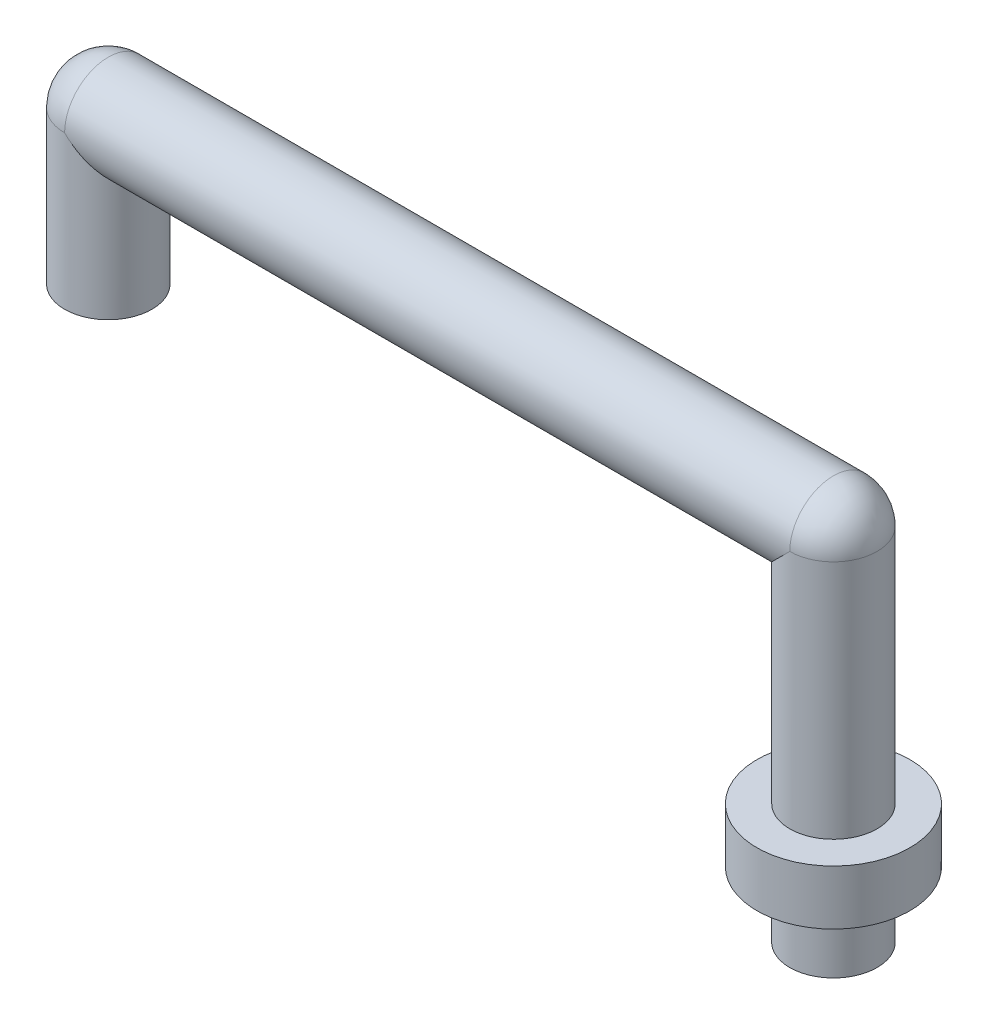
ISO-10303-21;
HEADER;
FILE_DESCRIPTION(('STEP AP214'),'2;1');
FILE_NAME('part.step','',(''),(''),'','','');
FILE_SCHEMA(('AUTOMOTIVE_DESIGN { 1 0 10303 214 1 1 1 1 }'));
ENDSEC;
DATA;
#1=APPLICATION_CONTEXT('core data for automotive mechanical design processes');
#2=APPLICATION_PROTOCOL_DEFINITION('international standard','automotive_design',2000,#1);
#3=PRODUCT_CONTEXT('',#1,'mechanical');
#4=PRODUCT('Part','Part','',(#3));
#5=PRODUCT_RELATED_PRODUCT_CATEGORY('part','',(#4));
#6=PRODUCT_DEFINITION_FORMATION('','',#4);
#7=PRODUCT_DEFINITION_CONTEXT('part definition',#1,'design');
#8=PRODUCT_DEFINITION('design','',#6,#7);
#9=PRODUCT_DEFINITION_SHAPE('','',#8);
#10=(LENGTH_UNIT() NAMED_UNIT(*) SI_UNIT(.MILLI.,.METRE.));
#11=(NAMED_UNIT(*) PLANE_ANGLE_UNIT() SI_UNIT($,.RADIAN.));
#12=(NAMED_UNIT(*) SI_UNIT($,.STERADIAN.) SOLID_ANGLE_UNIT());
#13=UNCERTAINTY_MEASURE_WITH_UNIT(LENGTH_MEASURE(1.E-05),#10,'distance_accuracy_value','');
#14=(GEOMETRIC_REPRESENTATION_CONTEXT(3) GLOBAL_UNCERTAINTY_ASSIGNED_CONTEXT((#13)) GLOBAL_UNIT_ASSIGNED_CONTEXT((#10,
#11,#12)) REPRESENTATION_CONTEXT('',''));
#15=CARTESIAN_POINT('',(0.,0.,0.));
#16=DIRECTION('',(0.,0.,1.));
#17=DIRECTION('',(1.,0.,0.));
#18=AXIS2_PLACEMENT_3D('',#15,#16,#17);
#19=CARTESIAN_POINT('',(0.,41.91,0.));
#20=DIRECTION('',(0.,-1.,0.));
#21=DIRECTION('',(0.,0.,-1.));
#22=AXIS2_PLACEMENT_3D('',#19,#20,#21);
#23=CYLINDRICAL_SURFACE('',#22,5.08);
#24=CARTESIAN_POINT('',(0.,13.97,0.));
#25=DIRECTION('',(0.,-1.,0.));
#26=DIRECTION('',(0.,0.,-1.));
#27=AXIS2_PLACEMENT_3D('',#24,#25,#26);
#28=CIRCLE('',#27,5.08);
#29=CARTESIAN_POINT('',(0.,13.97,-5.08));
#30=VERTEX_POINT('',#29);
#31=EDGE_CURVE('E13',#30,#30,#28,.T.);
#32=ORIENTED_EDGE('',*,*,#31,.F.);
#33=EDGE_LOOP('',(#32));
#34=FACE_BOUND('',#33,.T.);
#35=CARTESIAN_POINT('',(0.,41.91,0.));
#36=DIRECTION('',(0.707106781186547,-0.707106781186547,0.));
#37=DIRECTION('',(-0.707106781186547,-0.707106781186547,0.));
#38=AXIS2_PLACEMENT_3D('',#35,#36,#37);
#39=ELLIPSE('',#38,7.18420489685532,5.08);
#40=CARTESIAN_POINT('',(0.,41.91,-5.08));
#41=VERTEX_POINT('',#40);
#42=CARTESIAN_POINT('',(0.,41.91,5.08));
#43=VERTEX_POINT('',#42);
#44=EDGE_CURVE('E109',#41,#43,#39,.F.);
#45=ORIENTED_EDGE('',*,*,#44,.F.);
#46=CARTESIAN_POINT('',(0.,41.91,0.));
#47=DIRECTION('',(0.,1.,0.));
#48=DIRECTION('',(0.,0.,1.));
#49=AXIS2_PLACEMENT_3D('',#46,#47,#48);
#50=CIRCLE('',#49,5.08);
#51=EDGE_CURVE('E77',#43,#41,#50,.T.);
#52=ORIENTED_EDGE('',*,*,#51,.F.);
#53=EDGE_LOOP('',(#45,#52));
#54=FACE_BOUND('',#53,.T.);
#55=ADVANCED_FACE('F56',(#34,#54),#23,.T.);
#56=CARTESIAN_POINT('',(-8.89,13.97,0.));
#57=DIRECTION('',(0.,-1.,0.));
#58=DIRECTION('',(0.,0.,-1.));
#59=AXIS2_PLACEMENT_3D('',#56,#57,#58);
#60=PLANE('',#59);
#61=ORIENTED_EDGE('',*,*,#31,.T.);
#62=EDGE_LOOP('',(#61));
#63=FACE_BOUND('',#62,.T.);
#64=CARTESIAN_POINT('',(0.,13.97,0.));
#65=DIRECTION('',(0.,-1.,0.));
#66=DIRECTION('',(0.,0.,-1.));
#67=AXIS2_PLACEMENT_3D('',#64,#65,#66);
#68=CIRCLE('',#67,8.89);
#69=CARTESIAN_POINT('',(0.,13.97,-8.89));
#70=VERTEX_POINT('',#69);
#71=EDGE_CURVE('E116',#70,#70,#68,.T.);
#72=ORIENTED_EDGE('',*,*,#71,.F.);
#73=EDGE_LOOP('',(#72));
#74=FACE_BOUND('',#73,.T.);
#75=ADVANCED_FACE('F145',(#63,#74),#60,.F.);
#76=CARTESIAN_POINT('',(0.,0.,0.));
#77=DIRECTION('',(0.,-1.,0.));
#78=DIRECTION('',(0.,0.,-1.));
#79=AXIS2_PLACEMENT_3D('',#76,#77,#78);
#80=CYLINDRICAL_SURFACE('',#79,8.89);
#81=CARTESIAN_POINT('',(0.,7.62,0.));
#82=DIRECTION('',(0.,-1.,0.));
#83=DIRECTION('',(0.,0.,-1.));
#84=AXIS2_PLACEMENT_3D('',#81,#82,#83);
#85=CIRCLE('',#84,8.89);
#86=CARTESIAN_POINT('',(0.,7.62,-8.89));
#87=VERTEX_POINT('',#86);
#88=EDGE_CURVE('E112',#87,#87,#85,.T.);
#89=ORIENTED_EDGE('',*,*,#88,.F.);
#90=EDGE_LOOP('',(#89));
#91=FACE_BOUND('',#90,.T.);
#92=ORIENTED_EDGE('',*,*,#71,.T.);
#93=EDGE_LOOP('',(#92));
#94=FACE_BOUND('',#93,.T.);
#95=ADVANCED_FACE('F151',(#91,#94),#80,.T.);
#96=CARTESIAN_POINT('',(0.,7.62,0.));
#97=DIRECTION('',(0.,1.,0.));
#98=DIRECTION('',(0.,0.,1.));
#99=AXIS2_PLACEMENT_3D('',#96,#97,#98);
#100=PLANE('',#99);
#101=CARTESIAN_POINT('',(0.,7.61999999999999,0.));
#102=DIRECTION('',(0.,1.,0.));
#103=DIRECTION('',(0.,0.,1.));
#104=AXIS2_PLACEMENT_3D('',#101,#102,#103);
#105=CIRCLE('',#104,5.08);
#106=CARTESIAN_POINT('',(0.,7.61999999999999,5.08));
#107=VERTEX_POINT('',#106);
#108=EDGE_CURVE('E64',#107,#107,#105,.T.);
#109=ORIENTED_EDGE('',*,*,#108,.T.);
#110=EDGE_LOOP('',(#109));
#111=FACE_BOUND('',#110,.T.);
#112=ORIENTED_EDGE('',*,*,#88,.T.);
#113=EDGE_LOOP('',(#112));
#114=FACE_BOUND('',#113,.T.);
#115=ADVANCED_FACE('F129',(#111,#114),#100,.F.);
#116=CARTESIAN_POINT('',(0.,0.,0.));
#117=DIRECTION('',(0.,1.,0.));
#118=DIRECTION('',(0.,0.,1.));
#119=AXIS2_PLACEMENT_3D('',#116,#117,#118);
#120=PLANE('',#119);
#121=CARTESIAN_POINT('',(0.,0.,0.));
#122=DIRECTION('',(0.,-1.,0.));
#123=DIRECTION('',(0.,0.,-1.));
#124=AXIS2_PLACEMENT_3D('',#121,#122,#123);
#125=CIRCLE('',#124,2.54);
#126=CARTESIAN_POINT('',(0.,0.,-2.54));
#127=VERTEX_POINT('',#126);
#128=EDGE_CURVE('E252',#127,#127,#125,.T.);
#129=ORIENTED_EDGE('',*,*,#128,.F.);
#130=EDGE_LOOP('',(#129));
#131=FACE_BOUND('',#130,.T.);
#132=CARTESIAN_POINT('',(0.,0.,0.));
#133=DIRECTION('',(0.,1.,0.));
#134=DIRECTION('',(0.,0.,1.));
#135=AXIS2_PLACEMENT_3D('',#132,#133,#134);
#136=CIRCLE('',#135,5.08);
#137=CARTESIAN_POINT('',(0.,0.,5.08));
#138=VERTEX_POINT('',#137);
#139=EDGE_CURVE('E120',#138,#138,#136,.T.);
#140=ORIENTED_EDGE('',*,*,#139,.F.);
#141=EDGE_LOOP('',(#140));
#142=FACE_BOUND('',#141,.T.);
#143=ADVANCED_FACE('F134',(#131,#142),#120,.F.);
#144=ORIENTED_EDGE('',*,*,#139,.T.);
#145=EDGE_LOOP('',(#144));
#146=FACE_BOUND('',#145,.T.);
#147=ORIENTED_EDGE('',*,*,#108,.F.);
#148=EDGE_LOOP('',(#147));
#149=FACE_BOUND('',#148,.T.);
#150=ADVANCED_FACE('F132',(#146,#149),#23,.T.);
#151=CARTESIAN_POINT('',(-84.328,41.91,0.));
#152=DIRECTION('',(-1.,0.,0.));
#153=DIRECTION('',(0.,0.,1.));
#154=AXIS2_PLACEMENT_3D('',#151,#152,#153);
#155=CYLINDRICAL_SURFACE('',#154,5.08);
#156=CARTESIAN_POINT('',(-84.328,41.91,0.));
#157=DIRECTION('',(-1.,0.,0.));
#158=DIRECTION('',(0.,0.,1.));
#159=AXIS2_PLACEMENT_3D('',#156,#157,#158);
#160=CIRCLE('',#159,5.07999999999999);
#161=CARTESIAN_POINT('',(-84.328,41.91,5.07999999999999));
#162=VERTEX_POINT('',#161);
#163=CARTESIAN_POINT('',(-84.328,41.91,-5.07999999999999));
#164=VERTEX_POINT('',#163);
#165=EDGE_CURVE('E70',#162,#164,#160,.T.);
#166=ORIENTED_EDGE('',*,*,#165,.F.);
#167=CARTESIAN_POINT('',(-84.328,41.91,0.));
#168=DIRECTION('',(-0.707106781186547,-0.707106781186547,0.));
#169=DIRECTION('',(-0.707106781186547,0.707106781186547,0.));
#170=AXIS2_PLACEMENT_3D('',#167,#168,#169);
#171=ELLIPSE('',#170,7.18420489685531,5.07999999999999);
#172=EDGE_CURVE('E82',#162,#164,#171,.F.);
#173=ORIENTED_EDGE('',*,*,#172,.T.);
#174=EDGE_LOOP('',(#166,#173));
#175=FACE_BOUND('',#174,.T.);
#176=CARTESIAN_POINT('',(0.,41.91,0.));
#177=DIRECTION('',(-1.,0.,0.));
#178=DIRECTION('',(0.,0.,1.));
#179=AXIS2_PLACEMENT_3D('',#176,#177,#178);
#180=CIRCLE('',#179,5.08);
#181=EDGE_CURVE('E94',#43,#41,#180,.T.);
#182=ORIENTED_EDGE('',*,*,#181,.T.);
#183=ORIENTED_EDGE('',*,*,#44,.T.);
#184=EDGE_LOOP('',(#182,#183));
#185=FACE_BOUND('',#184,.T.);
#186=ADVANCED_FACE('F83',(#175,#185),#155,.T.);
#187=CARTESIAN_POINT('',(0.,41.91,0.));
#188=DIRECTION('',(-1.,0.,0.));
#189=DIRECTION('',(0.,0.,-1.));
#190=AXIS2_PLACEMENT_3D('',#187,#188,#189);
#191=SPHERICAL_SURFACE('',#190,5.08);
#192=ORIENTED_EDGE('',*,*,#51,.T.);
#193=ORIENTED_EDGE('',*,*,#181,.F.);
#194=EDGE_LOOP('',(#192,#193));
#195=FACE_BOUND('',#194,.T.);
#196=ADVANCED_FACE('F141',(#195),#191,.T.);
#197=CARTESIAN_POINT('',(-84.328,41.91,0.));
#198=DIRECTION('',(0.,1.,0.));
#199=DIRECTION('',(0.,0.,1.));
#200=AXIS2_PLACEMENT_3D('',#197,#198,#199);
#201=SPHERICAL_SURFACE('',#200,5.07999999999999);
#202=ORIENTED_EDGE('',*,*,#165,.T.);
#203=CARTESIAN_POINT('',(-84.328,41.91,0.));
#204=DIRECTION('',(0.,1.,0.));
#205=DIRECTION('',(0.,0.,1.));
#206=AXIS2_PLACEMENT_3D('',#203,#204,#205);
#207=CIRCLE('',#206,5.07999999999999);
#208=EDGE_CURVE('E89',#164,#162,#207,.T.);
#209=ORIENTED_EDGE('',*,*,#208,.T.);
#210=EDGE_LOOP('',(#202,#209));
#211=FACE_BOUND('',#210,.T.);
#212=ADVANCED_FACE('F92',(#211),#201,.T.);
#213=CARTESIAN_POINT('',(-84.328,46.99,0.));
#214=DIRECTION('',(0.,1.,0.));
#215=DIRECTION('',(0.,0.,1.));
#216=AXIS2_PLACEMENT_3D('',#213,#214,#215);
#217=CYLINDRICAL_SURFACE('',#216,5.07999999999999);
#218=CARTESIAN_POINT('',(-84.328,24.13,0.));
#219=DIRECTION('',(0.,1.,0.));
#220=DIRECTION('',(0.,0.,1.));
#221=AXIS2_PLACEMENT_3D('',#218,#219,#220);
#222=CIRCLE('',#221,5.07999999999999);
#223=CARTESIAN_POINT('',(-84.328,24.13,5.07999999999999));
#224=VERTEX_POINT('',#223);
#225=EDGE_CURVE('E98',#224,#224,#222,.T.);
#226=ORIENTED_EDGE('',*,*,#225,.T.);
#227=EDGE_LOOP('',(#226));
#228=FACE_BOUND('',#227,.T.);
#229=ORIENTED_EDGE('',*,*,#172,.F.);
#230=ORIENTED_EDGE('',*,*,#208,.F.);
#231=EDGE_LOOP('',(#229,#230));
#232=FACE_BOUND('',#231,.T.);
#233=ADVANCED_FACE('F96',(#228,#232),#217,.T.);
#234=CARTESIAN_POINT('',(-84.328,24.13,-5.07999999999999));
#235=DIRECTION('',(0.,-1.,0.));
#236=DIRECTION('',(0.,0.,-1.));
#237=AXIS2_PLACEMENT_3D('',#234,#235,#236);
#238=PLANE('',#237);
#239=CARTESIAN_POINT('',(-84.328,24.13,0.));
#240=DIRECTION('',(0.,-1.,0.));
#241=DIRECTION('',(0.,0.,-1.));
#242=AXIS2_PLACEMENT_3D('',#239,#240,#241);
#243=CIRCLE('',#242,2.54);
#244=CARTESIAN_POINT('',(-84.328,24.13,-2.53999999999999));
#245=VERTEX_POINT('',#244);
#246=EDGE_CURVE('E251',#245,#245,#243,.T.);
#247=ORIENTED_EDGE('',*,*,#246,.F.);
#248=EDGE_LOOP('',(#247));
#249=FACE_BOUND('',#248,.T.);
#250=ORIENTED_EDGE('',*,*,#225,.F.);
#251=EDGE_LOOP('',(#250));
#252=FACE_BOUND('',#251,.T.);
#253=ADVANCED_FACE('F197',(#249,#252),#238,.T.);
#254=CARTESIAN_POINT('',(-84.328,41.91,0.));
#255=DIRECTION('',(0.,-1.,0.));
#256=DIRECTION('',(0.,0.,-1.));
#257=AXIS2_PLACEMENT_3D('',#254,#255,#256);
#258=CYLINDRICAL_SURFACE('',#257,2.54);
#259=CARTESIAN_POINT('',(-84.328,41.91,0.));
#260=DIRECTION('',(0.,-1.,0.));
#261=DIRECTION('',(0.,0.,-1.));
#262=AXIS2_PLACEMENT_3D('',#259,#260,#261);
#263=CIRCLE('',#262,2.54);
#264=CARTESIAN_POINT('',(-84.328,41.91,-2.54));
#265=VERTEX_POINT('',#264);
#266=EDGE_CURVE('E102',#265,#265,#263,.T.);
#267=ORIENTED_EDGE('',*,*,#266,.F.);
#268=EDGE_LOOP('',(#267));
#269=FACE_BOUND('',#268,.T.);
#270=ORIENTED_EDGE('',*,*,#246,.T.);
#271=EDGE_LOOP('',(#270));
#272=FACE_BOUND('',#271,.T.);
#273=ADVANCED_FACE('F205',(#269,#272),#258,.F.);
#274=CARTESIAN_POINT('',(-84.328,41.91,0.));
#275=DIRECTION('',(0.,-1.,0.));
#276=DIRECTION('',(0.,0.,-1.));
#277=AXIS2_PLACEMENT_3D('',#274,#275,#276);
#278=PLANE('',#277);
#279=ORIENTED_EDGE('',*,*,#266,.T.);
#280=EDGE_LOOP('',(#279));
#281=FACE_BOUND('',#280,.T.);
#282=ADVANCED_FACE('F214',(#281),#278,.T.);
#283=CARTESIAN_POINT('',(0.,19.05,0.));
#284=DIRECTION('',(0.,-1.,0.));
#285=DIRECTION('',(0.,0.,-1.));
#286=AXIS2_PLACEMENT_3D('',#283,#284,#285);
#287=CYLINDRICAL_SURFACE('',#286,2.54);
#288=CARTESIAN_POINT('',(0.,19.05,0.));
#289=DIRECTION('',(0.,-1.,0.));
#290=DIRECTION('',(0.,0.,-1.));
#291=AXIS2_PLACEMENT_3D('',#288,#289,#290);
#292=CIRCLE('',#291,2.54);
#293=CARTESIAN_POINT('',(0.,19.05,-2.54));
#294=VERTEX_POINT('',#293);
#295=EDGE_CURVE('E249',#294,#294,#292,.T.);
#296=CARTESIAN_POINT('',(0.,19.05,-2.54));
#297=CARTESIAN_POINT('',(0.,18.8515625,-2.54));
#298=CARTESIAN_POINT('',(0.,18.653125,-2.54));
#299=CARTESIAN_POINT('',(0.,18.25625,-2.54));
#300=CARTESIAN_POINT('',(0.,18.0578125,-2.54));
#301=CARTESIAN_POINT('',(0.,17.6609375,-2.54));
#302=CARTESIAN_POINT('',(0.,17.4625,-2.54));
#303=CARTESIAN_POINT('',(0.,17.065625,-2.54));
#304=CARTESIAN_POINT('',(0.,16.8671875,-2.54));
#305=CARTESIAN_POINT('',(0.,16.4703125,-2.54));
#306=CARTESIAN_POINT('',(0.,16.271875,-2.54));
#307=CARTESIAN_POINT('',(0.,15.875,-2.54));
#308=CARTESIAN_POINT('',(0.,15.6765625,-2.54));
#309=CARTESIAN_POINT('',(0.,15.2796875,-2.54));
#310=CARTESIAN_POINT('',(0.,15.08125,-2.54));
#311=CARTESIAN_POINT('',(0.,14.684375,-2.54));
#312=CARTESIAN_POINT('',(0.,14.4859375,-2.54));
#313=CARTESIAN_POINT('',(0.,14.0890625,-2.54));
#314=CARTESIAN_POINT('',(0.,13.890625,-2.54));
#315=CARTESIAN_POINT('',(0.,13.49375,-2.54));
#316=CARTESIAN_POINT('',(0.,13.2953125,-2.54));
#317=CARTESIAN_POINT('',(0.,12.8984375,-2.54));
#318=CARTESIAN_POINT('',(0.,12.7,-2.54));
#319=CARTESIAN_POINT('',(0.,12.303125,-2.54));
#320=CARTESIAN_POINT('',(0.,12.1046875,-2.54));
#321=CARTESIAN_POINT('',(0.,11.7078125,-2.54));
#322=CARTESIAN_POINT('',(0.,11.509375,-2.54));
#323=CARTESIAN_POINT('',(0.,11.1125,-2.54));
#324=CARTESIAN_POINT('',(0.,10.9140625,-2.54));
#325=CARTESIAN_POINT('',(0.,10.5171875,-2.54));
#326=CARTESIAN_POINT('',(0.,10.31875,-2.54));
#327=CARTESIAN_POINT('',(0.,9.921875,-2.54));
#328=CARTESIAN_POINT('',(0.,9.7234375,-2.54));
#329=CARTESIAN_POINT('',(0.,9.3265625,-2.54));
#330=CARTESIAN_POINT('',(0.,9.128125,-2.54));
#331=CARTESIAN_POINT('',(0.,8.73125,-2.54));
#332=CARTESIAN_POINT('',(0.,8.5328125,-2.54));
#333=CARTESIAN_POINT('',(0.,8.1359375,-2.54));
#334=CARTESIAN_POINT('',(0.,7.9375,-2.54));
#335=CARTESIAN_POINT('',(0.,7.540625,-2.54));
#336=CARTESIAN_POINT('',(0.,7.3421875,-2.54));
#337=CARTESIAN_POINT('',(0.,6.9453125,-2.54));
#338=CARTESIAN_POINT('',(0.,6.746875,-2.54));
#339=CARTESIAN_POINT('',(0.,6.35,-2.54));
#340=CARTESIAN_POINT('',(0.,6.1515625,-2.54));
#341=CARTESIAN_POINT('',(0.,5.7546875,-2.54));
#342=CARTESIAN_POINT('',(0.,5.55625,-2.54));
#343=CARTESIAN_POINT('',(0.,5.159375,-2.54));
#344=CARTESIAN_POINT('',(0.,4.9609375,-2.54));
#345=CARTESIAN_POINT('',(0.,4.5640625,-2.54));
#346=CARTESIAN_POINT('',(0.,4.365625,-2.54));
#347=CARTESIAN_POINT('',(0.,3.96875,-2.54));
#348=CARTESIAN_POINT('',(0.,3.7703125,-2.54));
#349=CARTESIAN_POINT('',(0.,3.3734375,-2.54));
#350=CARTESIAN_POINT('',(0.,3.175,-2.54));
#351=CARTESIAN_POINT('',(0.,2.778125,-2.54));
#352=CARTESIAN_POINT('',(0.,2.5796875,-2.54));
#353=CARTESIAN_POINT('',(0.,2.1828125,-2.54));
#354=CARTESIAN_POINT('',(0.,1.984375,-2.54));
#355=CARTESIAN_POINT('',(0.,1.5875,-2.54));
#356=CARTESIAN_POINT('',(0.,1.3890625,-2.54));
#357=CARTESIAN_POINT('',(0.,0.992187500000001,-2.54));
#358=CARTESIAN_POINT('',(0.,0.793750000000001,-2.54));
#359=CARTESIAN_POINT('',(0.,0.396875,-2.54));
#360=CARTESIAN_POINT('',(0.,0.1984375,-2.54));
#361=CARTESIAN_POINT('',(0.,0.,-2.54));
#362=B_SPLINE_CURVE_WITH_KNOTS('',3,(#296,#297,#298,#299,#300,#301,#302,#303,#304,#305,#306,
#307,#308,#309,#310,#311,#312,#313,#314,#315,#316,#317,#318,#319,#320,#321,#322,#323,#324,#325,
#326,#327,#328,#329,#330,#331,#332,#333,#334,#335,#336,#337,#338,#339,#340,#341,#342,#343,#344,
#345,#346,#347,#348,#349,#350,#351,#352,#353,#354,#355,#356,#357,#358,#359,#360,#361),
.UNSPECIFIED.,.F.,.F.,(4,2,2,2,2,2,2,2,2,2,2,2,2,2,2,2,2,2,2,2,2,2,2,2,2,2,2,2,2,2,2,2,4),(0.,
0.595312499999997,1.190625,1.7859375,2.38125,2.9765625,3.571875,4.1671875,4.7625,5.3578125,
5.953125,6.5484375,7.14375,7.7390625,8.334375,8.9296875,9.525,10.1203125,10.715625,11.3109375,
11.90625,12.5015625,13.096875,13.6921875,14.2875,14.8828125,15.478125,16.0734375,16.66875,
17.2640625,17.859375,18.4546875,19.05),.UNSPECIFIED.);
#363=EDGE_CURVE('BSEAM224',#294,#127,#362,.T.);
#364=ORIENTED_EDGE('',*,*,#295,.F.);
#365=ORIENTED_EDGE('',*,*,#128,.T.);
#366=ORIENTED_EDGE('',*,*,#363,.T.);
#367=ORIENTED_EDGE('',*,*,#363,.F.);
#368=EDGE_LOOP('',(#364,#366,#365,#367));
#369=FACE_BOUND('',#368,.T.);
#370=ADVANCED_FACE('F224',(#369),#287,.F.);
#371=CARTESIAN_POINT('',(0.,19.05,0.));
#372=DIRECTION('',(0.,-1.,0.));
#373=DIRECTION('',(0.,0.,-1.));
#374=AXIS2_PLACEMENT_3D('',#371,#372,#373);
#375=PLANE('',#374);
#376=ORIENTED_EDGE('',*,*,#295,.T.);
#377=EDGE_LOOP('',(#376));
#378=FACE_BOUND('',#377,.T.);
#379=ADVANCED_FACE('F234',(#378),#375,.T.);
#380=CLOSED_SHELL('',(#55,#75,#95,#115,#143,#150,#186,#196,#212,#233,#253,#273,#282,#370,#379));
#381=MANIFOLD_SOLID_BREP('B2',#380);
#382=ADVANCED_BREP_SHAPE_REPRESENTATION('',(#18,#381),#14);
#383=SHAPE_DEFINITION_REPRESENTATION(#9,#382);
ENDSEC;
END-ISO-10303-21;
